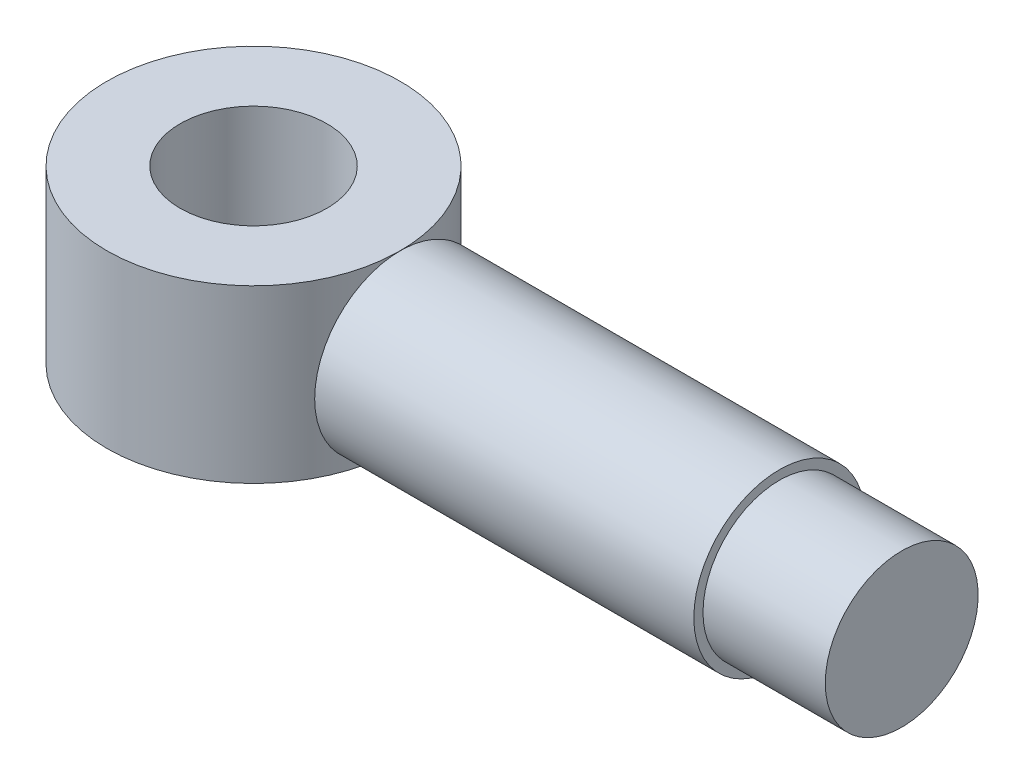
ISO-10303-21;
HEADER;
FILE_DESCRIPTION(('STEP AP214'),'2;1');
FILE_NAME('part.step','',(''),(''),'','','');
FILE_SCHEMA(('AUTOMOTIVE_DESIGN { 1 0 10303 214 1 1 1 1 }'));
ENDSEC;
DATA;
#1=APPLICATION_CONTEXT('core data for automotive mechanical design processes');
#2=APPLICATION_PROTOCOL_DEFINITION('international standard','automotive_design',2000,#1);
#3=PRODUCT_CONTEXT('',#1,'mechanical');
#4=PRODUCT('Part','Part','',(#3));
#5=PRODUCT_RELATED_PRODUCT_CATEGORY('part','',(#4));
#6=PRODUCT_DEFINITION_FORMATION('','',#4);
#7=PRODUCT_DEFINITION_CONTEXT('part definition',#1,'design');
#8=PRODUCT_DEFINITION('design','',#6,#7);
#9=PRODUCT_DEFINITION_SHAPE('','',#8);
#10=(LENGTH_UNIT() NAMED_UNIT(*) SI_UNIT(.MILLI.,.METRE.));
#11=(NAMED_UNIT(*) PLANE_ANGLE_UNIT() SI_UNIT($,.RADIAN.));
#12=(NAMED_UNIT(*) SI_UNIT($,.STERADIAN.) SOLID_ANGLE_UNIT());
#13=UNCERTAINTY_MEASURE_WITH_UNIT(LENGTH_MEASURE(1.E-05),#10,'distance_accuracy_value','');
#14=(GEOMETRIC_REPRESENTATION_CONTEXT(3) GLOBAL_UNCERTAINTY_ASSIGNED_CONTEXT((#13)) GLOBAL_UNIT_ASSIGNED_CONTEXT((#10,
#11,#12)) REPRESENTATION_CONTEXT('',''));
#15=CARTESIAN_POINT('',(0.,0.,0.));
#16=DIRECTION('',(0.,0.,1.));
#17=DIRECTION('',(1.,0.,0.));
#18=AXIS2_PLACEMENT_3D('',#15,#16,#17);
#19=CARTESIAN_POINT('',(24.,28.0000000000001,0.));
#20=DIRECTION('',(0.999999999999999,0.,0.));
#21=DIRECTION('',(0.,0.,-0.999999999999999));
#22=AXIS2_PLACEMENT_3D('',#19,#20,#21);
#23=PLANE('',#22);
#24=CARTESIAN_POINT('',(24.,14.,0.));
#25=DIRECTION('',(-0.999999999999999,0.,0.));
#26=DIRECTION('',(0.,0.,0.999999999999999));
#27=AXIS2_PLACEMENT_3D('',#24,#25,#26);
#28=CIRCLE('',#27,14.);
#29=CARTESIAN_POINT('',(24.,14.0000000000002,13.9999999999997));
#30=VERTEX_POINT('',#29);
#31=EDGE_CURVE('E74',#30,#30,#28,.T.);
#32=ORIENTED_EDGE('',*,*,#31,.T.);
#33=EDGE_LOOP('',(#32));
#34=FACE_BOUND('',#33,.T.);
#35=ADVANCED_FACE('F60',(#34),#23,.F.);
#36=CARTESIAN_POINT('',(86.,14.,0.));
#37=DIRECTION('',(-0.999999999999999,0.,0.));
#38=DIRECTION('',(0.,0.,0.999999999999999));
#39=AXIS2_PLACEMENT_3D('',#36,#37,#38);
#40=PLANE('',#39);
#41=CARTESIAN_POINT('',(86.,14.,0.));
#42=DIRECTION('',(0.999999999999999,0.,0.));
#43=DIRECTION('',(0.,0.,-0.999999999999999));
#44=AXIS2_PLACEMENT_3D('',#41,#42,#43);
#45=CIRCLE('',#44,12.5);
#46=CARTESIAN_POINT('',(86.,14.,12.5));
#47=VERTEX_POINT('',#46);
#48=EDGE_CURVE('E13',#47,#47,#45,.T.);
#49=ORIENTED_EDGE('',*,*,#48,.F.);
#50=EDGE_LOOP('',(#49));
#51=FACE_BOUND('',#50,.T.);
#52=CARTESIAN_POINT('',(86.0000000000001,14.,0.));
#53=DIRECTION('',(-0.999999999999999,0.,0.));
#54=DIRECTION('',(0.,0.,0.999999999999999));
#55=AXIS2_PLACEMENT_3D('',#52,#53,#54);
#56=CIRCLE('',#55,14.);
#57=CARTESIAN_POINT('',(86.0000000000002,14.0000000000002,13.9999999999997));
#58=VERTEX_POINT('',#57);
#59=EDGE_CURVE('E63',#58,#58,#56,.T.);
#60=ORIENTED_EDGE('',*,*,#59,.F.);
#61=EDGE_LOOP('',(#60));
#62=FACE_BOUND('',#61,.T.);
#63=ADVANCED_FACE('F98',(#51,#62),#40,.F.);
#64=CARTESIAN_POINT('',(-975.999999999999,14.0000000000004,0.));
#65=DIRECTION('',(-0.999999999999999,0.,0.));
#66=DIRECTION('',(0.,0.,0.999999999999999));
#67=AXIS2_PLACEMENT_3D('',#64,#65,#66);
#68=CYLINDRICAL_SURFACE('',#67,14.);
#69=CARTESIAN_POINT('',(24.,14.0000000000002,13.9999999999997));
#70=CARTESIAN_POINT('',(24.6458333333333,14.0000000000002,13.9999999999997));
#71=CARTESIAN_POINT('',(25.2916666666666,14.0000000000002,13.9999999999997));
#72=CARTESIAN_POINT('',(26.5833333333332,14.0000000000002,13.9999999999997));
#73=CARTESIAN_POINT('',(27.2291666666666,14.0000000000002,13.9999999999997));
#74=CARTESIAN_POINT('',(28.5208333333333,14.0000000000002,13.9999999999997));
#75=CARTESIAN_POINT('',(29.1666666666666,14.0000000000002,13.9999999999997));
#76=CARTESIAN_POINT('',(30.4583333333333,14.0000000000002,13.9999999999997));
#77=CARTESIAN_POINT('',(31.1041666666667,14.0000000000002,13.9999999999997));
#78=CARTESIAN_POINT('',(32.3958333333334,14.0000000000002,13.9999999999997));
#79=CARTESIAN_POINT('',(33.0416666666667,14.0000000000002,13.9999999999997));
#80=CARTESIAN_POINT('',(34.3333333333333,14.0000000000002,13.9999999999997));
#81=CARTESIAN_POINT('',(34.9791666666666,14.0000000000002,13.9999999999997));
#82=CARTESIAN_POINT('',(36.2708333333333,14.0000000000002,13.9999999999997));
#83=CARTESIAN_POINT('',(36.9166666666667,14.0000000000002,13.9999999999997));
#84=CARTESIAN_POINT('',(38.2083333333334,14.0000000000002,13.9999999999997));
#85=CARTESIAN_POINT('',(38.8541666666667,14.0000000000002,13.9999999999997));
#86=CARTESIAN_POINT('',(40.1458333333333,14.0000000000002,13.9999999999997));
#87=CARTESIAN_POINT('',(40.7916666666666,14.0000000000002,13.9999999999997));
#88=CARTESIAN_POINT('',(42.0833333333333,14.0000000000002,13.9999999999997));
#89=CARTESIAN_POINT('',(42.7291666666667,14.0000000000002,13.9999999999997));
#90=CARTESIAN_POINT('',(44.0208333333334,14.0000000000002,13.9999999999997));
#91=CARTESIAN_POINT('',(44.6666666666667,14.0000000000002,13.9999999999997));
#92=CARTESIAN_POINT('',(45.9583333333333,14.0000000000002,13.9999999999997));
#93=CARTESIAN_POINT('',(46.6041666666666,14.0000000000002,13.9999999999997));
#94=CARTESIAN_POINT('',(47.8958333333333,14.0000000000002,13.9999999999997));
#95=CARTESIAN_POINT('',(48.5416666666667,14.0000000000002,13.9999999999997));
#96=CARTESIAN_POINT('',(49.8333333333334,14.0000000000002,13.9999999999997));
#97=CARTESIAN_POINT('',(50.4791666666667,14.0000000000002,13.9999999999997));
#98=CARTESIAN_POINT('',(51.7708333333334,14.0000000000002,13.9999999999997));
#99=CARTESIAN_POINT('',(52.4166666666667,14.0000000000002,13.9999999999997));
#100=CARTESIAN_POINT('',(53.7083333333334,14.0000000000002,13.9999999999997));
#101=CARTESIAN_POINT('',(54.3541666666667,14.0000000000002,13.9999999999997));
#102=CARTESIAN_POINT('',(55.6458333333334,14.0000000000002,13.9999999999997));
#103=CARTESIAN_POINT('',(56.2916666666667,14.0000000000002,13.9999999999997));
#104=CARTESIAN_POINT('',(57.5833333333334,14.0000000000002,13.9999999999997));
#105=CARTESIAN_POINT('',(58.2291666666667,14.0000000000002,13.9999999999997));
#106=CARTESIAN_POINT('',(59.5208333333334,14.0000000000002,13.9999999999997));
#107=CARTESIAN_POINT('',(60.1666666666667,14.0000000000002,13.9999999999997));
#108=CARTESIAN_POINT('',(61.4583333333334,14.0000000000002,13.9999999999997));
#109=CARTESIAN_POINT('',(62.1041666666668,14.0000000000002,13.9999999999997));
#110=CARTESIAN_POINT('',(63.3958333333335,14.0000000000002,13.9999999999997));
#111=CARTESIAN_POINT('',(64.0416666666668,14.0000000000002,13.9999999999997));
#112=CARTESIAN_POINT('',(65.3333333333334,14.0000000000002,13.9999999999997));
#113=CARTESIAN_POINT('',(65.9791666666667,14.0000000000002,13.9999999999997));
#114=CARTESIAN_POINT('',(67.2708333333334,14.0000000000002,13.9999999999997));
#115=CARTESIAN_POINT('',(67.9166666666668,14.0000000000002,13.9999999999997));
#116=CARTESIAN_POINT('',(69.2083333333335,14.0000000000002,13.9999999999997));
#117=CARTESIAN_POINT('',(69.8541666666668,14.0000000000002,13.9999999999997));
#118=CARTESIAN_POINT('',(71.1458333333334,14.0000000000002,13.9999999999997));
#119=CARTESIAN_POINT('',(71.7916666666667,14.0000000000002,13.9999999999997));
#120=CARTESIAN_POINT('',(73.0833333333334,14.0000000000002,13.9999999999997));
#121=CARTESIAN_POINT('',(73.7291666666668,14.0000000000002,13.9999999999997));
#122=CARTESIAN_POINT('',(75.0208333333335,14.0000000000002,13.9999999999997));
#123=CARTESIAN_POINT('',(75.6666666666668,14.0000000000002,13.9999999999997));
#124=CARTESIAN_POINT('',(76.9583333333334,14.0000000000002,13.9999999999997));
#125=CARTESIAN_POINT('',(77.6041666666667,14.0000000000002,13.9999999999997));
#126=CARTESIAN_POINT('',(78.8958333333334,14.0000000000002,13.9999999999997));
#127=CARTESIAN_POINT('',(79.5416666666668,14.0000000000002,13.9999999999997));
#128=CARTESIAN_POINT('',(80.8333333333335,14.0000000000002,13.9999999999997));
#129=CARTESIAN_POINT('',(81.4791666666668,14.0000000000002,13.9999999999997));
#130=CARTESIAN_POINT('',(82.7708333333335,14.0000000000002,13.9999999999997));
#131=CARTESIAN_POINT('',(83.4166666666669,14.0000000000002,13.9999999999997));
#132=CARTESIAN_POINT('',(84.7083333333336,14.0000000000002,13.9999999999997));
#133=CARTESIAN_POINT('',(85.3541666666669,14.0000000000002,13.9999999999997));
#134=CARTESIAN_POINT('',(86.0000000000002,14.0000000000002,13.9999999999997));
#135=B_SPLINE_CURVE_WITH_KNOTS('',3,(#69,#70,#71,#72,#73,#74,#75,#76,#77,#78,#79,#80,#81,#82,
#83,#84,#85,#86,#87,#88,#89,#90,#91,#92,#93,#94,#95,#96,#97,#98,#99,#100,#101,#102,#103,#104,
#105,#106,#107,#108,#109,#110,#111,#112,#113,#114,#115,#116,#117,#118,#119,#120,#121,#122,#123,
#124,#125,#126,#127,#128,#129,#130,#131,#132,#133,#134),.UNSPECIFIED.,.F.,.F.,(4,2,2,2,2,2,2,2,
2,2,2,2,2,2,2,2,2,2,2,2,2,2,2,2,2,2,2,2,2,2,2,2,4),(0.,1.93749999999981,3.87499999999996,
5.81249999999989,7.75000000000003,9.68749999999996,11.6249999999999,13.5625,15.5,
17.4374999999999,19.375,21.3125,23.2499999999999,25.1875,27.125,29.0625000000001,31.,32.9375,
34.8750000000001,36.8125,38.7500000000002,40.6875000000001,42.625,44.5625000000002,
46.5000000000001,48.4375,50.3750000000002,52.3125000000001,54.25,56.1875000000002,
58.1250000000001,60.0625000000002,62.0000000000002),.UNSPECIFIED.);
#136=EDGE_CURVE('BSEAM91',#30,#58,#135,.T.);
#137=ORIENTED_EDGE('',*,*,#31,.F.);
#138=ORIENTED_EDGE('',*,*,#59,.T.);
#139=ORIENTED_EDGE('',*,*,#136,.T.);
#140=ORIENTED_EDGE('',*,*,#136,.F.);
#141=EDGE_LOOP('',(#137,#139,#138,#140));
#142=FACE_BOUND('',#141,.T.);
#143=ADVANCED_FACE('F91',(#142),#68,.T.);
#144=CARTESIAN_POINT('',(106.,14.,0.));
#145=DIRECTION('',(-0.999999999999999,0.,0.));
#146=DIRECTION('',(0.,0.,0.999999999999999));
#147=AXIS2_PLACEMENT_3D('',#144,#145,#146);
#148=CYLINDRICAL_SURFACE('',#147,12.5);
#149=CARTESIAN_POINT('',(106.,14.,0.));
#150=DIRECTION('',(0.999999999999999,0.,0.));
#151=DIRECTION('',(0.,0.,-0.999999999999999));
#152=AXIS2_PLACEMENT_3D('',#149,#150,#151);
#153=CIRCLE('',#152,12.5);
#154=CARTESIAN_POINT('',(106.,14.,12.5));
#155=VERTEX_POINT('',#154);
#156=EDGE_CURVE('E76',#155,#155,#153,.T.);
#157=CARTESIAN_POINT('',(106.,14.,12.5));
#158=CARTESIAN_POINT('',(105.791666666667,14.,12.5));
#159=CARTESIAN_POINT('',(105.583333333333,14.,12.5));
#160=CARTESIAN_POINT('',(105.166666666667,14.,12.5));
#161=CARTESIAN_POINT('',(104.958333333333,14.,12.5));
#162=CARTESIAN_POINT('',(104.541666666667,14.,12.5));
#163=CARTESIAN_POINT('',(104.333333333333,14.,12.5));
#164=CARTESIAN_POINT('',(103.916666666667,14.,12.5));
#165=CARTESIAN_POINT('',(103.708333333333,14.,12.5));
#166=CARTESIAN_POINT('',(103.291666666667,14.,12.5));
#167=CARTESIAN_POINT('',(103.083333333333,14.,12.5));
#168=CARTESIAN_POINT('',(102.666666666667,14.,12.5));
#169=CARTESIAN_POINT('',(102.458333333333,14.,12.5));
#170=CARTESIAN_POINT('',(102.041666666667,14.,12.5));
#171=CARTESIAN_POINT('',(101.833333333333,14.,12.5));
#172=CARTESIAN_POINT('',(101.416666666667,14.,12.5));
#173=CARTESIAN_POINT('',(101.208333333333,14.,12.5));
#174=CARTESIAN_POINT('',(100.791666666667,14.,12.5));
#175=CARTESIAN_POINT('',(100.583333333333,14.,12.5));
#176=CARTESIAN_POINT('',(100.166666666667,14.,12.5));
#177=CARTESIAN_POINT('',(99.9583333333333,14.,12.5));
#178=CARTESIAN_POINT('',(99.5416666666666,14.,12.5));
#179=CARTESIAN_POINT('',(99.3333333333333,14.,12.5));
#180=CARTESIAN_POINT('',(98.9166666666666,14.,12.5));
#181=CARTESIAN_POINT('',(98.7083333333333,14.,12.5));
#182=CARTESIAN_POINT('',(98.2916666666666,14.,12.5));
#183=CARTESIAN_POINT('',(98.0833333333333,14.,12.5));
#184=CARTESIAN_POINT('',(97.6666666666666,14.,12.5));
#185=CARTESIAN_POINT('',(97.4583333333333,14.,12.5));
#186=CARTESIAN_POINT('',(97.0416666666666,14.,12.5));
#187=CARTESIAN_POINT('',(96.8333333333333,14.,12.5));
#188=CARTESIAN_POINT('',(96.4166666666666,14.,12.5));
#189=CARTESIAN_POINT('',(96.2083333333333,14.,12.5));
#190=CARTESIAN_POINT('',(95.7916666666666,14.,12.5));
#191=CARTESIAN_POINT('',(95.5833333333333,14.,12.5));
#192=CARTESIAN_POINT('',(95.1666666666666,14.,12.5));
#193=CARTESIAN_POINT('',(94.9583333333333,14.,12.5));
#194=CARTESIAN_POINT('',(94.5416666666666,14.,12.5));
#195=CARTESIAN_POINT('',(94.3333333333333,14.,12.5));
#196=CARTESIAN_POINT('',(93.9166666666666,14.,12.5));
#197=CARTESIAN_POINT('',(93.7083333333333,14.,12.5));
#198=CARTESIAN_POINT('',(93.2916666666666,14.,12.5));
#199=CARTESIAN_POINT('',(93.0833333333333,14.,12.5));
#200=CARTESIAN_POINT('',(92.6666666666666,14.,12.5));
#201=CARTESIAN_POINT('',(92.4583333333333,14.,12.5));
#202=CARTESIAN_POINT('',(92.0416666666666,14.,12.5));
#203=CARTESIAN_POINT('',(91.8333333333333,14.,12.5));
#204=CARTESIAN_POINT('',(91.4166666666666,14.,12.5));
#205=CARTESIAN_POINT('',(91.2083333333333,14.,12.5));
#206=CARTESIAN_POINT('',(90.7916666666666,14.,12.5));
#207=CARTESIAN_POINT('',(90.5833333333333,14.,12.5));
#208=CARTESIAN_POINT('',(90.1666666666666,14.,12.5));
#209=CARTESIAN_POINT('',(89.9583333333333,14.,12.5));
#210=CARTESIAN_POINT('',(89.5416666666666,14.,12.5));
#211=CARTESIAN_POINT('',(89.3333333333333,14.,12.5));
#212=CARTESIAN_POINT('',(88.9166666666666,14.,12.5));
#213=CARTESIAN_POINT('',(88.7083333333333,14.,12.5));
#214=CARTESIAN_POINT('',(88.2916666666666,14.,12.5));
#215=CARTESIAN_POINT('',(88.0833333333333,14.,12.5));
#216=CARTESIAN_POINT('',(87.6666666666666,14.,12.5));
#217=CARTESIAN_POINT('',(87.4583333333333,14.,12.5));
#218=CARTESIAN_POINT('',(87.0416666666666,14.,12.5));
#219=CARTESIAN_POINT('',(86.8333333333333,14.,12.5));
#220=CARTESIAN_POINT('',(86.4166666666666,14.,12.5));
#221=CARTESIAN_POINT('',(86.2083333333333,14.,12.5));
#222=CARTESIAN_POINT('',(86.,14.,12.5));
#223=B_SPLINE_CURVE_WITH_KNOTS('',3,(#157,#158,#159,#160,#161,#162,#163,#164,#165,#166,#167,
#168,#169,#170,#171,#172,#173,#174,#175,#176,#177,#178,#179,#180,#181,#182,#183,#184,#185,#186,
#187,#188,#189,#190,#191,#192,#193,#194,#195,#196,#197,#198,#199,#200,#201,#202,#203,#204,#205,
#206,#207,#208,#209,#210,#211,#212,#213,#214,#215,#216,#217,#218,#219,#220,#221,#222),
.UNSPECIFIED.,.F.,.F.,(4,2,2,2,2,2,2,2,2,2,2,2,2,2,2,2,2,2,2,2,2,2,2,2,2,2,2,2,2,2,2,2,4),(0.,
0.624999999999987,1.24999999999999,1.87499999999999,2.49999999999999,3.12499999999999,
3.74999999999999,4.37499999999999,4.99999999999999,5.62499999999999,6.24999999999999,
6.87499999999999,7.49999999999999,8.12499999999999,8.74999999999999,9.37499999999999,
9.99999999999999,10.625,11.25,11.875,12.5,13.125,13.75,14.375,15.,15.625,16.25,16.875,17.5,
18.125,18.75,19.375,20.),.UNSPECIFIED.);
#224=EDGE_CURVE('BSEAM89',#155,#47,#223,.T.);
#225=ORIENTED_EDGE('',*,*,#156,.F.);
#226=ORIENTED_EDGE('',*,*,#48,.T.);
#227=ORIENTED_EDGE('',*,*,#224,.T.);
#228=ORIENTED_EDGE('',*,*,#224,.F.);
#229=EDGE_LOOP('',(#225,#227,#226,#228));
#230=FACE_BOUND('',#229,.T.);
#231=ADVANCED_FACE('F89',(#230),#148,.T.);
#232=CARTESIAN_POINT('',(106.,14.,0.));
#233=DIRECTION('',(0.999999999999999,0.,0.));
#234=DIRECTION('',(0.,0.,-0.999999999999999));
#235=AXIS2_PLACEMENT_3D('',#232,#233,#234);
#236=PLANE('',#235);
#237=ORIENTED_EDGE('',*,*,#156,.T.);
#238=EDGE_LOOP('',(#237));
#239=FACE_BOUND('',#238,.T.);
#240=ADVANCED_FACE('F87',(#239),#236,.T.);
#241=CLOSED_SHELL('',(#35,#63,#143,#231,#240));
#242=MANIFOLD_SOLID_BREP('B2',#241);
#243=CARTESIAN_POINT('',(0.,28.0000000000001,0.));
#244=DIRECTION('',(0.,1.,0.));
#245=DIRECTION('',(0.,0.,0.999999999999999));
#246=AXIS2_PLACEMENT_3D('',#243,#244,#245);
#247=PLANE('',#246);
#248=CARTESIAN_POINT('',(0.,28.0000000000001,0.));
#249=DIRECTION('',(0.,1.,0.));
#250=DIRECTION('',(0.,0.,0.999999999999999));
#251=AXIS2_PLACEMENT_3D('',#248,#249,#250);
#252=CIRCLE('',#251,24.);
#253=CARTESIAN_POINT('',(0.,28.0000000000001,24.));
#254=VERTEX_POINT('',#253);
#255=EDGE_CURVE('E59',#254,#254,#252,.T.);
#256=ORIENTED_EDGE('',*,*,#255,.T.);
#257=EDGE_LOOP('',(#256));
#258=FACE_BOUND('',#257,.T.);
#259=CARTESIAN_POINT('',(0.,28.0000000000001,0.));
#260=DIRECTION('',(0.,1.,0.));
#261=DIRECTION('',(0.,0.,0.999999999999999));
#262=AXIS2_PLACEMENT_3D('',#259,#260,#261);
#263=CIRCLE('',#262,12.);
#264=CARTESIAN_POINT('',(0.,28.0000000000001,12.));
#265=VERTEX_POINT('',#264);
#266=EDGE_CURVE('E158',#265,#265,#263,.T.);
#267=ORIENTED_EDGE('',*,*,#266,.F.);
#268=EDGE_LOOP('',(#267));
#269=FACE_BOUND('',#268,.T.);
#270=ADVANCED_FACE('F144',(#258,#269),#247,.T.);
#271=CARTESIAN_POINT('',(0.,0.,0.));
#272=DIRECTION('',(0.,1.,0.));
#273=DIRECTION('',(0.,0.,0.999999999999999));
#274=AXIS2_PLACEMENT_3D('',#271,#272,#273);
#275=PLANE('',#274);
#276=CARTESIAN_POINT('',(0.,0.,0.));
#277=DIRECTION('',(0.,1.,0.));
#278=DIRECTION('',(0.,0.,0.999999999999999));
#279=AXIS2_PLACEMENT_3D('',#276,#277,#278);
#280=CIRCLE('',#279,24.);
#281=CARTESIAN_POINT('',(0.,0.,24.));
#282=VERTEX_POINT('',#281);
#283=EDGE_CURVE('E148',#282,#282,#280,.T.);
#284=ORIENTED_EDGE('',*,*,#283,.F.);
#285=EDGE_LOOP('',(#284));
#286=FACE_BOUND('',#285,.T.);
#287=CARTESIAN_POINT('',(0.,0.,0.));
#288=DIRECTION('',(0.,1.,0.));
#289=DIRECTION('',(0.,0.,0.999999999999999));
#290=AXIS2_PLACEMENT_3D('',#287,#288,#289);
#291=CIRCLE('',#290,12.);
#292=CARTESIAN_POINT('',(0.,0.,12.));
#293=VERTEX_POINT('',#292);
#294=EDGE_CURVE('E160',#293,#293,#291,.T.);
#295=ORIENTED_EDGE('',*,*,#294,.T.);
#296=EDGE_LOOP('',(#295));
#297=FACE_BOUND('',#296,.T.);
#298=ADVANCED_FACE('F173',(#286,#297),#275,.F.);
#299=CARTESIAN_POINT('',(0.,28.0000000000001,0.));
#300=DIRECTION('',(0.,-1.,0.));
#301=DIRECTION('',(0.,0.,-0.999999999999999));
#302=AXIS2_PLACEMENT_3D('',#299,#300,#301);
#303=CYLINDRICAL_SURFACE('',#302,24.);
#304=ORIENTED_EDGE('',*,*,#283,.T.);
#305=EDGE_LOOP('',(#304));
#306=FACE_BOUND('',#305,.T.);
#307=ORIENTED_EDGE('',*,*,#255,.F.);
#308=EDGE_LOOP('',(#307));
#309=FACE_BOUND('',#308,.T.);
#310=ADVANCED_FACE('F146',(#306,#309),#303,.T.);
#311=CARTESIAN_POINT('',(0.,28.0000000000001,0.));
#312=DIRECTION('',(0.,-1.,0.));
#313=DIRECTION('',(0.,0.,-0.999999999999999));
#314=AXIS2_PLACEMENT_3D('',#311,#312,#313);
#315=CYLINDRICAL_SURFACE('',#314,12.);
#316=ORIENTED_EDGE('',*,*,#266,.T.);
#317=EDGE_LOOP('',(#316));
#318=FACE_BOUND('',#317,.T.);
#319=ORIENTED_EDGE('',*,*,#294,.F.);
#320=EDGE_LOOP('',(#319));
#321=FACE_BOUND('',#320,.T.);
#322=ADVANCED_FACE('F169',(#318,#321),#315,.F.);
#323=CLOSED_SHELL('',(#270,#298,#310,#322));
#324=MANIFOLD_SOLID_BREP('B8',#323);
#325=ADVANCED_BREP_SHAPE_REPRESENTATION('',(#18,#242,#324),#14);
#326=SHAPE_DEFINITION_REPRESENTATION(#9,#325);
ENDSEC;
END-ISO-10303-21;
